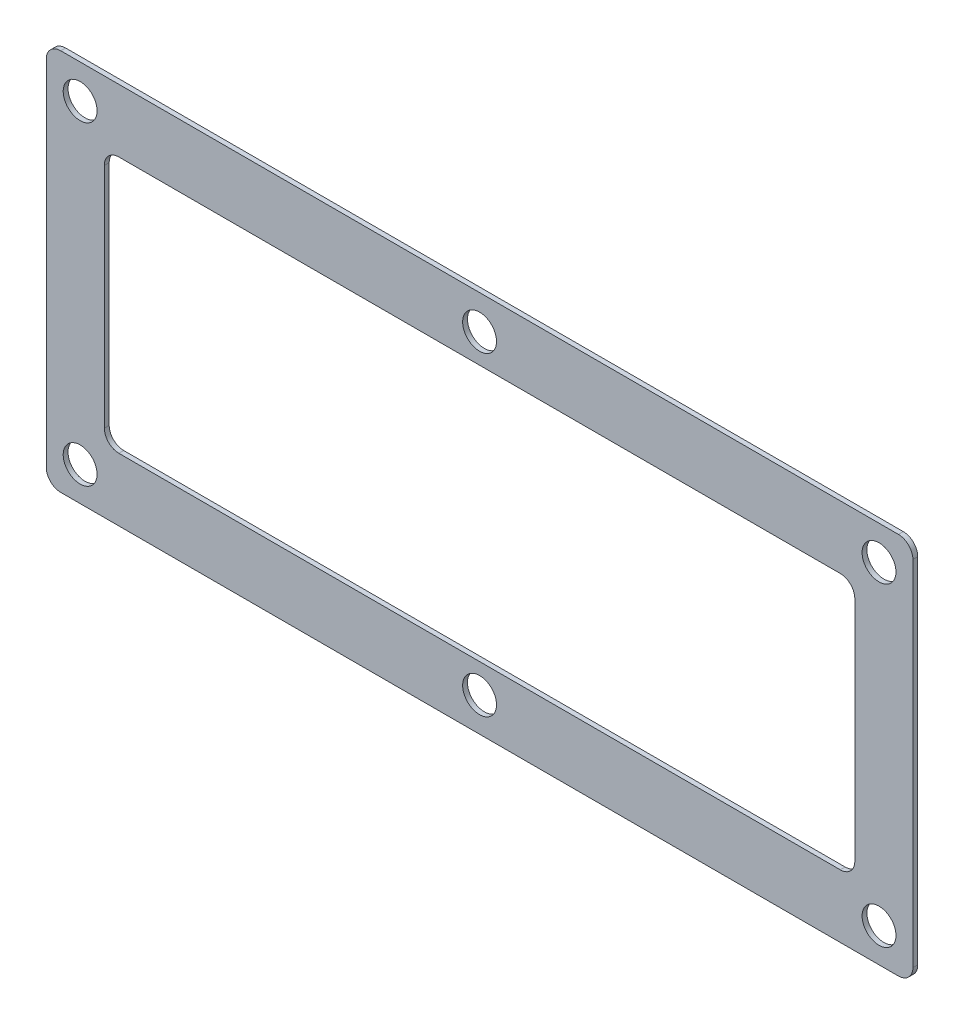
ISO-10303-21;
HEADER;
FILE_DESCRIPTION(('STEP AP214'),'2;1');
FILE_NAME('part.step','',(''),(''),'','','');
FILE_SCHEMA(('AUTOMOTIVE_DESIGN { 1 0 10303 214 1 1 1 1 }'));
ENDSEC;
DATA;
#1=APPLICATION_CONTEXT('core data for automotive mechanical design processes');
#2=APPLICATION_PROTOCOL_DEFINITION('international standard','automotive_design',2000,#1);
#3=PRODUCT_CONTEXT('',#1,'mechanical');
#4=PRODUCT('Part','Part','',(#3));
#5=PRODUCT_RELATED_PRODUCT_CATEGORY('part','',(#4));
#6=PRODUCT_DEFINITION_FORMATION('','',#4);
#7=PRODUCT_DEFINITION_CONTEXT('part definition',#1,'design');
#8=PRODUCT_DEFINITION('design','',#6,#7);
#9=PRODUCT_DEFINITION_SHAPE('','',#8);
#10=(LENGTH_UNIT() NAMED_UNIT(*) SI_UNIT(.MILLI.,.METRE.));
#11=(NAMED_UNIT(*) PLANE_ANGLE_UNIT() SI_UNIT($,.RADIAN.));
#12=(NAMED_UNIT(*) SI_UNIT($,.STERADIAN.) SOLID_ANGLE_UNIT());
#13=UNCERTAINTY_MEASURE_WITH_UNIT(LENGTH_MEASURE(1.E-05),#10,'distance_accuracy_value','');
#14=(GEOMETRIC_REPRESENTATION_CONTEXT(3) GLOBAL_UNCERTAINTY_ASSIGNED_CONTEXT((#13)) GLOBAL_UNIT_ASSIGNED_CONTEXT((#10,
#11,#12)) REPRESENTATION_CONTEXT('',''));
#15=CARTESIAN_POINT('',(0.,0.,0.));
#16=DIRECTION('',(0.,0.,1.));
#17=DIRECTION('',(1.,0.,0.));
#18=AXIS2_PLACEMENT_3D('',#15,#16,#17);
#19=CARTESIAN_POINT('',(0.,0.,0.));
#20=DIRECTION('',(0.,0.,-1.));
#21=DIRECTION('',(-1.,0.,0.));
#22=AXIS2_PLACEMENT_3D('',#19,#20,#21);
#23=PLANE('',#22);
#24=DIRECTION('',(-1.,0.,0.));
#25=VECTOR('',#24,1.);
#26=CARTESIAN_POINT('',(77.5,26.5,0.));
#27=LINE('',#26,#25);
#28=CARTESIAN_POINT('',(74.5,26.5,0.));
#29=VERTEX_POINT('',#28);
#30=CARTESIAN_POINT('',(-74.5,26.5,0.));
#31=VERTEX_POINT('',#30);
#32=EDGE_CURVE('E277',#29,#31,#27,.T.);
#33=ORIENTED_EDGE('',*,*,#32,.T.);
#34=CARTESIAN_POINT('',(-74.5,23.5,0.));
#35=DIRECTION('',(0.,0.,-1.));
#36=DIRECTION('',(-1.,0.,0.));
#37=AXIS2_PLACEMENT_3D('',#34,#35,#36);
#38=CIRCLE('',#37,3.);
#39=CARTESIAN_POINT('',(-77.5,23.5,0.));
#40=VERTEX_POINT('',#39);
#41=EDGE_CURVE('E11',#31,#40,#38,.F.);
#42=ORIENTED_EDGE('',*,*,#41,.T.);
#43=DIRECTION('',(0.,-1.,0.));
#44=VECTOR('',#43,1.);
#45=CARTESIAN_POINT('',(-77.5,-26.5,0.));
#46=LINE('',#45,#44);
#47=CARTESIAN_POINT('',(-77.5,-23.5,0.));
#48=VERTEX_POINT('',#47);
#49=EDGE_CURVE('E264',#40,#48,#46,.T.);
#50=ORIENTED_EDGE('',*,*,#49,.T.);
#51=CARTESIAN_POINT('',(-74.5,-23.5,0.));
#52=DIRECTION('',(0.,0.,-1.));
#53=DIRECTION('',(-1.,0.,0.));
#54=AXIS2_PLACEMENT_3D('',#51,#52,#53);
#55=CIRCLE('',#54,3.);
#56=CARTESIAN_POINT('',(-74.5,-26.5,0.));
#57=VERTEX_POINT('',#56);
#58=EDGE_CURVE('E247',#48,#57,#55,.F.);
#59=ORIENTED_EDGE('',*,*,#58,.T.);
#60=DIRECTION('',(1.,0.,0.));
#61=VECTOR('',#60,1.);
#62=CARTESIAN_POINT('',(77.5,-26.5,0.));
#63=LINE('',#62,#61);
#64=CARTESIAN_POINT('',(74.5,-26.5,0.));
#65=VERTEX_POINT('',#64);
#66=EDGE_CURVE('E269',#57,#65,#63,.T.);
#67=ORIENTED_EDGE('',*,*,#66,.T.);
#68=CARTESIAN_POINT('',(74.5,-23.5,0.));
#69=DIRECTION('',(0.,0.,-1.));
#70=DIRECTION('',(-1.,0.,0.));
#71=AXIS2_PLACEMENT_3D('',#68,#69,#70);
#72=CIRCLE('',#71,3.);
#73=CARTESIAN_POINT('',(77.5,-23.5,0.));
#74=VERTEX_POINT('',#73);
#75=EDGE_CURVE('E243',#65,#74,#72,.F.);
#76=ORIENTED_EDGE('',*,*,#75,.T.);
#77=DIRECTION('',(0.,1.,0.));
#78=VECTOR('',#77,1.);
#79=CARTESIAN_POINT('',(77.5,-26.5,0.));
#80=LINE('',#79,#78);
#81=CARTESIAN_POINT('',(77.5,23.5,0.));
#82=VERTEX_POINT('',#81);
#83=EDGE_CURVE('E272',#74,#82,#80,.T.);
#84=ORIENTED_EDGE('',*,*,#83,.T.);
#85=CARTESIAN_POINT('',(74.5,23.5,0.));
#86=DIRECTION('',(0.,0.,-1.));
#87=DIRECTION('',(-1.,0.,0.));
#88=AXIS2_PLACEMENT_3D('',#85,#86,#87);
#89=CIRCLE('',#88,3.);
#90=EDGE_CURVE('E239',#82,#29,#89,.F.);
#91=ORIENTED_EDGE('',*,*,#90,.T.);
#92=EDGE_LOOP('',(#33,#42,#50,#59,#67,#76,#84,#91));
#93=FACE_BOUND('',#92,.T.);
#94=CARTESIAN_POINT('',(-82.5,32.5,0.));
#95=DIRECTION('',(0.,0.,1.));
#96=DIRECTION('',(1.,0.,0.));
#97=AXIS2_PLACEMENT_3D('',#94,#95,#96);
#98=CIRCLE('',#97,3.5);
#99=CARTESIAN_POINT('',(-79.,32.5,0.));
#100=VERTEX_POINT('',#99);
#101=EDGE_CURVE('E294',#100,#100,#98,.T.);
#102=ORIENTED_EDGE('',*,*,#101,.T.);
#103=EDGE_LOOP('',(#102));
#104=FACE_BOUND('',#103,.T.);
#105=CARTESIAN_POINT('',(82.5,-32.5,0.));
#106=DIRECTION('',(0.,0.,1.));
#107=DIRECTION('',(1.,0.,0.));
#108=AXIS2_PLACEMENT_3D('',#105,#106,#107);
#109=CIRCLE('',#108,3.5);
#110=CARTESIAN_POINT('',(86.,-32.5,0.));
#111=VERTEX_POINT('',#110);
#112=EDGE_CURVE('E306',#111,#111,#109,.T.);
#113=ORIENTED_EDGE('',*,*,#112,.T.);
#114=EDGE_LOOP('',(#113));
#115=FACE_BOUND('',#114,.T.);
#116=CARTESIAN_POINT('',(0.,-32.5,0.));
#117=DIRECTION('',(0.,0.,1.));
#118=DIRECTION('',(1.,0.,0.));
#119=AXIS2_PLACEMENT_3D('',#116,#117,#118);
#120=CIRCLE('',#119,3.5);
#121=CARTESIAN_POINT('',(3.50000000000001,-32.5,0.));
#122=VERTEX_POINT('',#121);
#123=EDGE_CURVE('E312',#122,#122,#120,.T.);
#124=ORIENTED_EDGE('',*,*,#123,.T.);
#125=EDGE_LOOP('',(#124));
#126=FACE_BOUND('',#125,.T.);
#127=DIRECTION('',(0.,1.,0.));
#128=VECTOR('',#127,1.);
#129=CARTESIAN_POINT('',(89.5,-39.5,0.));
#130=LINE('',#129,#128);
#131=CARTESIAN_POINT('',(89.5,-36.5,0.));
#132=VERTEX_POINT('',#131);
#133=CARTESIAN_POINT('',(89.5,36.5,0.));
#134=VERTEX_POINT('',#133);
#135=EDGE_CURVE('E166',#132,#134,#130,.T.);
#136=ORIENTED_EDGE('',*,*,#135,.F.);
#137=CARTESIAN_POINT('',(86.5,-36.5,0.));
#138=DIRECTION('',(0.,0.,-1.));
#139=DIRECTION('',(-1.,0.,0.));
#140=AXIS2_PLACEMENT_3D('',#137,#138,#139);
#141=CIRCLE('',#140,3.);
#142=CARTESIAN_POINT('',(86.5,-39.5,0.));
#143=VERTEX_POINT('',#142);
#144=EDGE_CURVE('E149',#132,#143,#141,.T.);
#145=ORIENTED_EDGE('',*,*,#144,.T.);
#146=DIRECTION('',(1.,0.,0.));
#147=VECTOR('',#146,1.);
#148=CARTESIAN_POINT('',(-89.5,-39.5,0.));
#149=LINE('',#148,#147);
#150=CARTESIAN_POINT('',(-86.5,-39.5,0.));
#151=VERTEX_POINT('',#150);
#152=EDGE_CURVE('E190',#151,#143,#149,.T.);
#153=ORIENTED_EDGE('',*,*,#152,.F.);
#154=CARTESIAN_POINT('',(-86.5,-36.5,0.));
#155=DIRECTION('',(0.,0.,-1.));
#156=DIRECTION('',(-1.,0.,0.));
#157=AXIS2_PLACEMENT_3D('',#154,#155,#156);
#158=CIRCLE('',#157,3.);
#159=CARTESIAN_POINT('',(-89.5,-36.5,0.));
#160=VERTEX_POINT('',#159);
#161=EDGE_CURVE('E160',#151,#160,#158,.T.);
#162=ORIENTED_EDGE('',*,*,#161,.T.);
#163=DIRECTION('',(0.,-1.,0.));
#164=VECTOR('',#163,1.);
#165=CARTESIAN_POINT('',(-89.5,-39.5,0.));
#166=LINE('',#165,#164);
#167=CARTESIAN_POINT('',(-89.5,36.5,0.));
#168=VERTEX_POINT('',#167);
#169=EDGE_CURVE('E179',#168,#160,#166,.T.);
#170=ORIENTED_EDGE('',*,*,#169,.F.);
#171=CARTESIAN_POINT('',(-86.5,36.5,0.));
#172=DIRECTION('',(0.,0.,-1.));
#173=DIRECTION('',(-1.,0.,0.));
#174=AXIS2_PLACEMENT_3D('',#171,#172,#173);
#175=CIRCLE('',#174,3.);
#176=CARTESIAN_POINT('',(-86.5,39.5,0.));
#177=VERTEX_POINT('',#176);
#178=EDGE_CURVE('E194',#168,#177,#175,.T.);
#179=ORIENTED_EDGE('',*,*,#178,.T.);
#180=DIRECTION('',(-1.,0.,0.));
#181=VECTOR('',#180,1.);
#182=CARTESIAN_POINT('',(-89.5,39.5,0.));
#183=LINE('',#182,#181);
#184=CARTESIAN_POINT('',(86.5,39.5,0.));
#185=VERTEX_POINT('',#184);
#186=EDGE_CURVE('E175',#185,#177,#183,.T.);
#187=ORIENTED_EDGE('',*,*,#186,.F.);
#188=CARTESIAN_POINT('',(86.5,36.5,0.));
#189=DIRECTION('',(0.,0.,-1.));
#190=DIRECTION('',(-1.,0.,0.));
#191=AXIS2_PLACEMENT_3D('',#188,#189,#190);
#192=CIRCLE('',#191,3.);
#193=EDGE_CURVE('E170',#185,#134,#192,.T.);
#194=ORIENTED_EDGE('',*,*,#193,.T.);
#195=EDGE_LOOP('',(#136,#145,#153,#162,#170,#179,#187,#194));
#196=FACE_BOUND('',#195,.T.);
#197=CARTESIAN_POINT('',(-82.5,-32.5,0.));
#198=DIRECTION('',(0.,0.,1.));
#199=DIRECTION('',(1.,0.,0.));
#200=AXIS2_PLACEMENT_3D('',#197,#198,#199);
#201=CIRCLE('',#200,3.5);
#202=CARTESIAN_POINT('',(-79.,-32.5,0.));
#203=VERTEX_POINT('',#202);
#204=EDGE_CURVE('E176',#203,#203,#201,.T.);
#205=ORIENTED_EDGE('',*,*,#204,.T.);
#206=EDGE_LOOP('',(#205));
#207=FACE_BOUND('',#206,.T.);
#208=CARTESIAN_POINT('',(82.5,32.5,0.));
#209=DIRECTION('',(0.,0.,1.));
#210=DIRECTION('',(1.,0.,0.));
#211=AXIS2_PLACEMENT_3D('',#208,#209,#210);
#212=CIRCLE('',#211,3.5);
#213=CARTESIAN_POINT('',(86.,32.5,0.));
#214=VERTEX_POINT('',#213);
#215=EDGE_CURVE('E300',#214,#214,#212,.T.);
#216=ORIENTED_EDGE('',*,*,#215,.T.);
#217=EDGE_LOOP('',(#216));
#218=FACE_BOUND('',#217,.T.);
#219=CARTESIAN_POINT('',(0.,32.5,0.));
#220=DIRECTION('',(0.,0.,1.));
#221=DIRECTION('',(1.,0.,0.));
#222=AXIS2_PLACEMENT_3D('',#219,#220,#221);
#223=CIRCLE('',#222,3.5);
#224=CARTESIAN_POINT('',(3.5,32.5,0.));
#225=VERTEX_POINT('',#224);
#226=EDGE_CURVE('E288',#225,#225,#223,.T.);
#227=ORIENTED_EDGE('',*,*,#226,.T.);
#228=EDGE_LOOP('',(#227));
#229=FACE_BOUND('',#228,.T.);
#230=ADVANCED_FACE('F36',(#93,#104,#115,#126,#196,#207,#218,#229),#23,.T.);
#231=CARTESIAN_POINT('',(89.5,-39.5,1.));
#232=DIRECTION('',(-1.,0.,0.));
#233=DIRECTION('',(0.,0.,1.));
#234=AXIS2_PLACEMENT_3D('',#231,#232,#233);
#235=PLANE('',#234);
#236=DIRECTION('',(0.,1.,0.));
#237=VECTOR('',#236,1.);
#238=CARTESIAN_POINT('',(89.5,-39.5,1.));
#239=LINE('',#238,#237);
#240=CARTESIAN_POINT('',(89.5,-36.5,1.));
#241=VERTEX_POINT('',#240);
#242=CARTESIAN_POINT('',(89.5,36.5,1.));
#243=VERTEX_POINT('',#242);
#244=EDGE_CURVE('E169',#241,#243,#239,.T.);
#245=ORIENTED_EDGE('',*,*,#244,.F.);
#246=DIRECTION('',(0.,0.,-1.));
#247=VECTOR('',#246,1.);
#248=CARTESIAN_POINT('',(89.5,-36.5,1.));
#249=LINE('',#248,#247);
#250=EDGE_CURVE('E153',#241,#132,#249,.T.);
#251=ORIENTED_EDGE('',*,*,#250,.T.);
#252=ORIENTED_EDGE('',*,*,#135,.T.);
#253=DIRECTION('',(0.,0.,-1.));
#254=VECTOR('',#253,1.);
#255=CARTESIAN_POINT('',(89.5,36.5,1.));
#256=LINE('',#255,#254);
#257=EDGE_CURVE('E171',#134,#243,#256,.F.);
#258=ORIENTED_EDGE('',*,*,#257,.T.);
#259=EDGE_LOOP('',(#245,#251,#252,#258));
#260=FACE_BOUND('',#259,.T.);
#261=ADVANCED_FACE('F165',(#260),#235,.F.);
#262=CARTESIAN_POINT('',(-89.5,39.5,1.));
#263=DIRECTION('',(0.,-1.,0.));
#264=DIRECTION('',(0.,0.,-1.));
#265=AXIS2_PLACEMENT_3D('',#262,#263,#264);
#266=PLANE('',#265);
#267=ORIENTED_EDGE('',*,*,#186,.T.);
#268=DIRECTION('',(0.,0.,-1.));
#269=VECTOR('',#268,1.);
#270=CARTESIAN_POINT('',(-86.5,39.5,1.));
#271=LINE('',#270,#269);
#272=CARTESIAN_POINT('',(-86.5,39.5,1.));
#273=VERTEX_POINT('',#272);
#274=EDGE_CURVE('E216',#177,#273,#271,.F.);
#275=ORIENTED_EDGE('',*,*,#274,.T.);
#276=DIRECTION('',(-1.,0.,0.));
#277=VECTOR('',#276,1.);
#278=CARTESIAN_POINT('',(-89.5,39.5,1.));
#279=LINE('',#278,#277);
#280=CARTESIAN_POINT('',(86.5,39.5,1.));
#281=VERTEX_POINT('',#280);
#282=EDGE_CURVE('E318',#281,#273,#279,.T.);
#283=ORIENTED_EDGE('',*,*,#282,.F.);
#284=DIRECTION('',(0.,0.,-1.));
#285=VECTOR('',#284,1.);
#286=CARTESIAN_POINT('',(86.5,39.5,1.));
#287=LINE('',#286,#285);
#288=EDGE_CURVE('E213',#281,#185,#287,.T.);
#289=ORIENTED_EDGE('',*,*,#288,.T.);
#290=EDGE_LOOP('',(#267,#275,#283,#289));
#291=FACE_BOUND('',#290,.T.);
#292=ADVANCED_FACE('F342',(#291),#266,.F.);
#293=CARTESIAN_POINT('',(-89.5,-39.5,1.));
#294=DIRECTION('',(1.,0.,0.));
#295=DIRECTION('',(0.,0.,-1.));
#296=AXIS2_PLACEMENT_3D('',#293,#294,#295);
#297=PLANE('',#296);
#298=ORIENTED_EDGE('',*,*,#169,.T.);
#299=DIRECTION('',(0.,0.,-1.));
#300=VECTOR('',#299,1.);
#301=CARTESIAN_POINT('',(-89.5,-36.5,1.));
#302=LINE('',#301,#300);
#303=CARTESIAN_POINT('',(-89.5,-36.5,1.));
#304=VERTEX_POINT('',#303);
#305=EDGE_CURVE('E211',#160,#304,#302,.F.);
#306=ORIENTED_EDGE('',*,*,#305,.T.);
#307=DIRECTION('',(0.,-1.,0.));
#308=VECTOR('',#307,1.);
#309=CARTESIAN_POINT('',(-89.5,-39.5,1.));
#310=LINE('',#309,#308);
#311=CARTESIAN_POINT('',(-89.5,36.5,1.));
#312=VERTEX_POINT('',#311);
#313=EDGE_CURVE('E320',#312,#304,#310,.T.);
#314=ORIENTED_EDGE('',*,*,#313,.F.);
#315=DIRECTION('',(0.,0.,-1.));
#316=VECTOR('',#315,1.);
#317=CARTESIAN_POINT('',(-89.5,36.5,1.));
#318=LINE('',#317,#316);
#319=EDGE_CURVE('E208',#312,#168,#318,.T.);
#320=ORIENTED_EDGE('',*,*,#319,.T.);
#321=EDGE_LOOP('',(#298,#306,#314,#320));
#322=FACE_BOUND('',#321,.T.);
#323=ADVANCED_FACE('F335',(#322),#297,.F.);
#324=CARTESIAN_POINT('',(-89.5,-39.5,1.));
#325=DIRECTION('',(0.,1.,0.));
#326=DIRECTION('',(0.,0.,1.));
#327=AXIS2_PLACEMENT_3D('',#324,#325,#326);
#328=PLANE('',#327);
#329=ORIENTED_EDGE('',*,*,#152,.T.);
#330=DIRECTION('',(0.,0.,-1.));
#331=VECTOR('',#330,1.);
#332=CARTESIAN_POINT('',(86.5,-39.5,1.));
#333=LINE('',#332,#331);
#334=CARTESIAN_POINT('',(86.5,-39.5,1.));
#335=VERTEX_POINT('',#334);
#336=EDGE_CURVE('E154',#143,#335,#333,.F.);
#337=ORIENTED_EDGE('',*,*,#336,.T.);
#338=DIRECTION('',(1.,0.,0.));
#339=VECTOR('',#338,1.);
#340=CARTESIAN_POINT('',(-89.5,-39.5,1.));
#341=LINE('',#340,#339);
#342=CARTESIAN_POINT('',(-86.5,-39.5,1.));
#343=VERTEX_POINT('',#342);
#344=EDGE_CURVE('E185',#343,#335,#341,.T.);
#345=ORIENTED_EDGE('',*,*,#344,.F.);
#346=DIRECTION('',(0.,0.,-1.));
#347=VECTOR('',#346,1.);
#348=CARTESIAN_POINT('',(-86.5,-39.5,1.));
#349=LINE('',#348,#347);
#350=EDGE_CURVE('E159',#343,#151,#349,.T.);
#351=ORIENTED_EDGE('',*,*,#350,.T.);
#352=EDGE_LOOP('',(#329,#337,#345,#351));
#353=FACE_BOUND('',#352,.T.);
#354=ADVANCED_FACE('F329',(#353),#328,.F.);
#355=CARTESIAN_POINT('',(0.,0.,1.));
#356=DIRECTION('',(0.,0.,-1.));
#357=DIRECTION('',(-1.,0.,0.));
#358=AXIS2_PLACEMENT_3D('',#355,#356,#357);
#359=PLANE('',#358);
#360=DIRECTION('',(1.,0.,0.));
#361=VECTOR('',#360,1.);
#362=CARTESIAN_POINT('',(77.5,-26.5,1.));
#363=LINE('',#362,#361);
#364=CARTESIAN_POINT('',(-74.5,-26.5,1.));
#365=VERTEX_POINT('',#364);
#366=CARTESIAN_POINT('',(74.5,-26.5,1.));
#367=VERTEX_POINT('',#366);
#368=EDGE_CURVE('E281',#365,#367,#363,.T.);
#369=ORIENTED_EDGE('',*,*,#368,.F.);
#370=CARTESIAN_POINT('',(-74.5,-23.5,1.));
#371=DIRECTION('',(0.,0.,-1.));
#372=DIRECTION('',(-1.,0.,0.));
#373=AXIS2_PLACEMENT_3D('',#370,#371,#372);
#374=CIRCLE('',#373,3.);
#375=CARTESIAN_POINT('',(-77.5,-23.5,1.));
#376=VERTEX_POINT('',#375);
#377=EDGE_CURVE('E245',#365,#376,#374,.T.);
#378=ORIENTED_EDGE('',*,*,#377,.T.);
#379=DIRECTION('',(0.,-1.,0.));
#380=VECTOR('',#379,1.);
#381=CARTESIAN_POINT('',(-77.5,-26.5,1.));
#382=LINE('',#381,#380);
#383=CARTESIAN_POINT('',(-77.5,23.5,1.));
#384=VERTEX_POINT('',#383);
#385=EDGE_CURVE('E256',#384,#376,#382,.T.);
#386=ORIENTED_EDGE('',*,*,#385,.F.);
#387=CARTESIAN_POINT('',(-74.5,23.5,1.));
#388=DIRECTION('',(0.,0.,-1.));
#389=DIRECTION('',(-1.,0.,0.));
#390=AXIS2_PLACEMENT_3D('',#387,#388,#389);
#391=CIRCLE('',#390,3.);
#392=CARTESIAN_POINT('',(-74.5,26.5,1.));
#393=VERTEX_POINT('',#392);
#394=EDGE_CURVE('E44',#384,#393,#391,.T.);
#395=ORIENTED_EDGE('',*,*,#394,.T.);
#396=DIRECTION('',(-1.,0.,0.));
#397=VECTOR('',#396,1.);
#398=CARTESIAN_POINT('',(77.5,26.5,1.));
#399=LINE('',#398,#397);
#400=CARTESIAN_POINT('',(74.5,26.5,1.));
#401=VERTEX_POINT('',#400);
#402=EDGE_CURVE('E255',#401,#393,#399,.T.);
#403=ORIENTED_EDGE('',*,*,#402,.F.);
#404=CARTESIAN_POINT('',(74.5,23.5,1.));
#405=DIRECTION('',(0.,0.,-1.));
#406=DIRECTION('',(-1.,0.,0.));
#407=AXIS2_PLACEMENT_3D('',#404,#405,#406);
#408=CIRCLE('',#407,3.);
#409=CARTESIAN_POINT('',(77.5,23.5,1.));
#410=VERTEX_POINT('',#409);
#411=EDGE_CURVE('E237',#401,#410,#408,.T.);
#412=ORIENTED_EDGE('',*,*,#411,.T.);
#413=DIRECTION('',(0.,1.,0.));
#414=VECTOR('',#413,1.);
#415=CARTESIAN_POINT('',(77.5,-26.5,1.));
#416=LINE('',#415,#414);
#417=CARTESIAN_POINT('',(77.5,-23.5,1.));
#418=VERTEX_POINT('',#417);
#419=EDGE_CURVE('E265',#418,#410,#416,.T.);
#420=ORIENTED_EDGE('',*,*,#419,.F.);
#421=CARTESIAN_POINT('',(74.5,-23.5,1.));
#422=DIRECTION('',(0.,0.,-1.));
#423=DIRECTION('',(-1.,0.,0.));
#424=AXIS2_PLACEMENT_3D('',#421,#422,#423);
#425=CIRCLE('',#424,3.);
#426=EDGE_CURVE('E241',#418,#367,#425,.T.);
#427=ORIENTED_EDGE('',*,*,#426,.T.);
#428=EDGE_LOOP('',(#369,#378,#386,#395,#403,#412,#420,#427));
#429=FACE_BOUND('',#428,.T.);
#430=CARTESIAN_POINT('',(0.,32.5,1.));
#431=DIRECTION('',(0.,0.,1.));
#432=DIRECTION('',(1.,0.,0.));
#433=AXIS2_PLACEMENT_3D('',#430,#431,#432);
#434=CIRCLE('',#433,3.5);
#435=CARTESIAN_POINT('',(3.5,32.5,1.));
#436=VERTEX_POINT('',#435);
#437=EDGE_CURVE('E279',#436,#436,#434,.T.);
#438=ORIENTED_EDGE('',*,*,#437,.F.);
#439=EDGE_LOOP('',(#438));
#440=FACE_BOUND('',#439,.T.);
#441=CARTESIAN_POINT('',(-82.5,32.5,1.));
#442=DIRECTION('',(0.,0.,1.));
#443=DIRECTION('',(1.,0.,0.));
#444=AXIS2_PLACEMENT_3D('',#441,#442,#443);
#445=CIRCLE('',#444,3.5);
#446=CARTESIAN_POINT('',(-79.,32.5,1.));
#447=VERTEX_POINT('',#446);
#448=EDGE_CURVE('E291',#447,#447,#445,.T.);
#449=ORIENTED_EDGE('',*,*,#448,.F.);
#450=EDGE_LOOP('',(#449));
#451=FACE_BOUND('',#450,.T.);
#452=CARTESIAN_POINT('',(82.5,32.5,1.));
#453=DIRECTION('',(0.,0.,1.));
#454=DIRECTION('',(1.,0.,0.));
#455=AXIS2_PLACEMENT_3D('',#452,#453,#454);
#456=CIRCLE('',#455,3.5);
#457=CARTESIAN_POINT('',(86.,32.5,1.));
#458=VERTEX_POINT('',#457);
#459=EDGE_CURVE('E297',#458,#458,#456,.T.);
#460=ORIENTED_EDGE('',*,*,#459,.F.);
#461=EDGE_LOOP('',(#460));
#462=FACE_BOUND('',#461,.T.);
#463=CARTESIAN_POINT('',(82.5,-32.5,1.));
#464=DIRECTION('',(0.,0.,1.));
#465=DIRECTION('',(1.,0.,0.));
#466=AXIS2_PLACEMENT_3D('',#463,#464,#465);
#467=CIRCLE('',#466,3.5);
#468=CARTESIAN_POINT('',(86.,-32.5,1.));
#469=VERTEX_POINT('',#468);
#470=EDGE_CURVE('E303',#469,#469,#467,.T.);
#471=ORIENTED_EDGE('',*,*,#470,.F.);
#472=EDGE_LOOP('',(#471));
#473=FACE_BOUND('',#472,.T.);
#474=CARTESIAN_POINT('',(0.,-32.5,1.));
#475=DIRECTION('',(0.,0.,1.));
#476=DIRECTION('',(1.,0.,0.));
#477=AXIS2_PLACEMENT_3D('',#474,#475,#476);
#478=CIRCLE('',#477,3.5);
#479=CARTESIAN_POINT('',(3.50000000000001,-32.5,1.));
#480=VERTEX_POINT('',#479);
#481=EDGE_CURVE('E309',#480,#480,#478,.T.);
#482=ORIENTED_EDGE('',*,*,#481,.F.);
#483=EDGE_LOOP('',(#482));
#484=FACE_BOUND('',#483,.T.);
#485=CARTESIAN_POINT('',(-82.5,-32.5,1.));
#486=DIRECTION('',(0.,0.,1.));
#487=DIRECTION('',(1.,0.,0.));
#488=AXIS2_PLACEMENT_3D('',#485,#486,#487);
#489=CIRCLE('',#488,3.5);
#490=CARTESIAN_POINT('',(-79.,-32.5,1.));
#491=VERTEX_POINT('',#490);
#492=EDGE_CURVE('E182',#491,#491,#489,.T.);
#493=ORIENTED_EDGE('',*,*,#492,.F.);
#494=EDGE_LOOP('',(#493));
#495=FACE_BOUND('',#494,.T.);
#496=ORIENTED_EDGE('',*,*,#344,.T.);
#497=CARTESIAN_POINT('',(86.5,-36.5,1.));
#498=DIRECTION('',(0.,0.,-1.));
#499=DIRECTION('',(-1.,0.,0.));
#500=AXIS2_PLACEMENT_3D('',#497,#498,#499);
#501=CIRCLE('',#500,3.);
#502=EDGE_CURVE('E206',#335,#241,#501,.F.);
#503=ORIENTED_EDGE('',*,*,#502,.T.);
#504=ORIENTED_EDGE('',*,*,#244,.T.);
#505=CARTESIAN_POINT('',(86.5,36.5,1.));
#506=DIRECTION('',(0.,0.,-1.));
#507=DIRECTION('',(-1.,0.,0.));
#508=AXIS2_PLACEMENT_3D('',#505,#506,#507);
#509=CIRCLE('',#508,3.);
#510=EDGE_CURVE('E200',#243,#281,#509,.F.);
#511=ORIENTED_EDGE('',*,*,#510,.T.);
#512=ORIENTED_EDGE('',*,*,#282,.T.);
#513=CARTESIAN_POINT('',(-86.5,36.5,1.));
#514=DIRECTION('',(0.,0.,-1.));
#515=DIRECTION('',(-1.,0.,0.));
#516=AXIS2_PLACEMENT_3D('',#513,#514,#515);
#517=CIRCLE('',#516,3.);
#518=EDGE_CURVE('E202',#273,#312,#517,.F.);
#519=ORIENTED_EDGE('',*,*,#518,.T.);
#520=ORIENTED_EDGE('',*,*,#313,.T.);
#521=CARTESIAN_POINT('',(-86.5,-36.5,1.));
#522=DIRECTION('',(0.,0.,-1.));
#523=DIRECTION('',(-1.,0.,0.));
#524=AXIS2_PLACEMENT_3D('',#521,#522,#523);
#525=CIRCLE('',#524,3.);
#526=EDGE_CURVE('E204',#304,#343,#525,.F.);
#527=ORIENTED_EDGE('',*,*,#526,.T.);
#528=EDGE_LOOP('',(#496,#503,#504,#511,#512,#519,#520,#527));
#529=FACE_BOUND('',#528,.T.);
#530=ADVANCED_FACE('F253',(#429,#440,#451,#462,#473,#484,#495,#529),#359,.F.);
#531=CARTESIAN_POINT('',(86.5,-36.5,1.));
#532=DIRECTION('',(0.,0.,-1.));
#533=DIRECTION('',(-1.,0.,0.));
#534=AXIS2_PLACEMENT_3D('',#531,#532,#533);
#535=CYLINDRICAL_SURFACE('',#534,3.);
#536=ORIENTED_EDGE('',*,*,#502,.F.);
#537=ORIENTED_EDGE('',*,*,#336,.F.);
#538=ORIENTED_EDGE('',*,*,#144,.F.);
#539=ORIENTED_EDGE('',*,*,#250,.F.);
#540=EDGE_LOOP('',(#536,#537,#538,#539));
#541=FACE_BOUND('',#540,.T.);
#542=ADVANCED_FACE('F152',(#541),#535,.T.);
#543=CARTESIAN_POINT('',(-86.5,-36.5,1.));
#544=DIRECTION('',(0.,0.,-1.));
#545=DIRECTION('',(-1.,0.,0.));
#546=AXIS2_PLACEMENT_3D('',#543,#544,#545);
#547=CYLINDRICAL_SURFACE('',#546,3.);
#548=ORIENTED_EDGE('',*,*,#526,.F.);
#549=ORIENTED_EDGE('',*,*,#305,.F.);
#550=ORIENTED_EDGE('',*,*,#161,.F.);
#551=ORIENTED_EDGE('',*,*,#350,.F.);
#552=EDGE_LOOP('',(#548,#549,#550,#551));
#553=FACE_BOUND('',#552,.T.);
#554=ADVANCED_FACE('F331',(#553),#547,.T.);
#555=CARTESIAN_POINT('',(-86.5,36.5,1.));
#556=DIRECTION('',(0.,0.,-1.));
#557=DIRECTION('',(-1.,0.,0.));
#558=AXIS2_PLACEMENT_3D('',#555,#556,#557);
#559=CYLINDRICAL_SURFACE('',#558,3.);
#560=ORIENTED_EDGE('',*,*,#518,.F.);
#561=ORIENTED_EDGE('',*,*,#274,.F.);
#562=ORIENTED_EDGE('',*,*,#178,.F.);
#563=ORIENTED_EDGE('',*,*,#319,.F.);
#564=EDGE_LOOP('',(#560,#561,#562,#563));
#565=FACE_BOUND('',#564,.T.);
#566=ADVANCED_FACE('F339',(#565),#559,.T.);
#567=CARTESIAN_POINT('',(86.5,36.5,1.));
#568=DIRECTION('',(0.,0.,-1.));
#569=DIRECTION('',(-1.,0.,0.));
#570=AXIS2_PLACEMENT_3D('',#567,#568,#569);
#571=CYLINDRICAL_SURFACE('',#570,3.);
#572=ORIENTED_EDGE('',*,*,#510,.F.);
#573=ORIENTED_EDGE('',*,*,#257,.F.);
#574=ORIENTED_EDGE('',*,*,#193,.F.);
#575=ORIENTED_EDGE('',*,*,#288,.F.);
#576=EDGE_LOOP('',(#572,#573,#574,#575));
#577=FACE_BOUND('',#576,.T.);
#578=ADVANCED_FACE('F347',(#577),#571,.T.);
#579=CARTESIAN_POINT('',(-82.5,-32.5,1.));
#580=DIRECTION('',(0.,0.,1.));
#581=DIRECTION('',(1.,0.,0.));
#582=AXIS2_PLACEMENT_3D('',#579,#580,#581);
#583=CYLINDRICAL_SURFACE('',#582,3.5);
#584=ORIENTED_EDGE('',*,*,#204,.F.);
#585=EDGE_LOOP('',(#584));
#586=FACE_BOUND('',#585,.T.);
#587=ORIENTED_EDGE('',*,*,#492,.T.);
#588=EDGE_LOOP('',(#587));
#589=FACE_BOUND('',#588,.T.);
#590=ADVANCED_FACE('F349',(#586,#589),#583,.F.);
#591=CARTESIAN_POINT('',(0.,-32.5,1.));
#592=DIRECTION('',(0.,0.,1.));
#593=DIRECTION('',(1.,0.,0.));
#594=AXIS2_PLACEMENT_3D('',#591,#592,#593);
#595=CYLINDRICAL_SURFACE('',#594,3.5);
#596=ORIENTED_EDGE('',*,*,#123,.F.);
#597=EDGE_LOOP('',(#596));
#598=FACE_BOUND('',#597,.T.);
#599=ORIENTED_EDGE('',*,*,#481,.T.);
#600=EDGE_LOOP('',(#599));
#601=FACE_BOUND('',#600,.T.);
#602=ADVANCED_FACE('F355',(#598,#601),#595,.F.);
#603=CARTESIAN_POINT('',(82.5,-32.5,1.));
#604=DIRECTION('',(0.,0.,1.));
#605=DIRECTION('',(1.,0.,0.));
#606=AXIS2_PLACEMENT_3D('',#603,#604,#605);
#607=CYLINDRICAL_SURFACE('',#606,3.5);
#608=ORIENTED_EDGE('',*,*,#112,.F.);
#609=EDGE_LOOP('',(#608));
#610=FACE_BOUND('',#609,.T.);
#611=ORIENTED_EDGE('',*,*,#470,.T.);
#612=EDGE_LOOP('',(#611));
#613=FACE_BOUND('',#612,.T.);
#614=ADVANCED_FACE('F406',(#610,#613),#607,.F.);
#615=CARTESIAN_POINT('',(82.5,32.5,1.));
#616=DIRECTION('',(0.,0.,1.));
#617=DIRECTION('',(1.,0.,0.));
#618=AXIS2_PLACEMENT_3D('',#615,#616,#617);
#619=CYLINDRICAL_SURFACE('',#618,3.5);
#620=ORIENTED_EDGE('',*,*,#215,.F.);
#621=EDGE_LOOP('',(#620));
#622=FACE_BOUND('',#621,.T.);
#623=ORIENTED_EDGE('',*,*,#459,.T.);
#624=EDGE_LOOP('',(#623));
#625=FACE_BOUND('',#624,.T.);
#626=ADVANCED_FACE('F416',(#622,#625),#619,.F.);
#627=CARTESIAN_POINT('',(-82.5,32.5,1.));
#628=DIRECTION('',(0.,0.,1.));
#629=DIRECTION('',(1.,0.,0.));
#630=AXIS2_PLACEMENT_3D('',#627,#628,#629);
#631=CYLINDRICAL_SURFACE('',#630,3.5);
#632=ORIENTED_EDGE('',*,*,#101,.F.);
#633=EDGE_LOOP('',(#632));
#634=FACE_BOUND('',#633,.T.);
#635=ORIENTED_EDGE('',*,*,#448,.T.);
#636=EDGE_LOOP('',(#635));
#637=FACE_BOUND('',#636,.T.);
#638=ADVANCED_FACE('F426',(#634,#637),#631,.F.);
#639=CARTESIAN_POINT('',(0.,32.5,1.));
#640=DIRECTION('',(0.,0.,1.));
#641=DIRECTION('',(1.,0.,0.));
#642=AXIS2_PLACEMENT_3D('',#639,#640,#641);
#643=CYLINDRICAL_SURFACE('',#642,3.5);
#644=ORIENTED_EDGE('',*,*,#226,.F.);
#645=EDGE_LOOP('',(#644));
#646=FACE_BOUND('',#645,.T.);
#647=ORIENTED_EDGE('',*,*,#437,.T.);
#648=EDGE_LOOP('',(#647));
#649=FACE_BOUND('',#648,.T.);
#650=ADVANCED_FACE('F436',(#646,#649),#643,.F.);
#651=CARTESIAN_POINT('',(-77.5,-26.5,0.));
#652=DIRECTION('',(-1.,0.,0.));
#653=DIRECTION('',(0.,0.,1.));
#654=AXIS2_PLACEMENT_3D('',#651,#652,#653);
#655=PLANE('',#654);
#656=ORIENTED_EDGE('',*,*,#385,.T.);
#657=DIRECTION('',(0.,0.,1.));
#658=VECTOR('',#657,1.);
#659=CARTESIAN_POINT('',(-77.5,-23.5,0.));
#660=LINE('',#659,#658);
#661=EDGE_CURVE('E51',#376,#48,#660,.F.);
#662=ORIENTED_EDGE('',*,*,#661,.T.);
#663=ORIENTED_EDGE('',*,*,#49,.F.);
#664=DIRECTION('',(0.,0.,1.));
#665=VECTOR('',#664,1.);
#666=CARTESIAN_POINT('',(-77.5,23.5,1.));
#667=LINE('',#666,#665);
#668=EDGE_CURVE('E233',#40,#384,#667,.T.);
#669=ORIENTED_EDGE('',*,*,#668,.T.);
#670=EDGE_LOOP('',(#656,#662,#663,#669));
#671=FACE_BOUND('',#670,.T.);
#672=ADVANCED_FACE('F267',(#671),#655,.F.);
#673=CARTESIAN_POINT('',(77.5,26.5,0.));
#674=DIRECTION('',(0.,1.,0.));
#675=DIRECTION('',(0.,0.,1.));
#676=AXIS2_PLACEMENT_3D('',#673,#674,#675);
#677=PLANE('',#676);
#678=ORIENTED_EDGE('',*,*,#32,.F.);
#679=DIRECTION('',(0.,0.,1.));
#680=VECTOR('',#679,1.);
#681=CARTESIAN_POINT('',(74.5,26.5,1.));
#682=LINE('',#681,#680);
#683=EDGE_CURVE('E220',#29,#401,#682,.T.);
#684=ORIENTED_EDGE('',*,*,#683,.T.);
#685=ORIENTED_EDGE('',*,*,#402,.T.);
#686=DIRECTION('',(0.,0.,1.));
#687=VECTOR('',#686,1.);
#688=CARTESIAN_POINT('',(-74.5,26.5,0.));
#689=LINE('',#688,#687);
#690=EDGE_CURVE('E218',#393,#31,#689,.F.);
#691=ORIENTED_EDGE('',*,*,#690,.T.);
#692=EDGE_LOOP('',(#678,#684,#685,#691));
#693=FACE_BOUND('',#692,.T.);
#694=ADVANCED_FACE('F262',(#693),#677,.F.);
#695=CARTESIAN_POINT('',(77.5,-26.5,0.));
#696=DIRECTION('',(1.,0.,0.));
#697=DIRECTION('',(0.,0.,-1.));
#698=AXIS2_PLACEMENT_3D('',#695,#696,#697);
#699=PLANE('',#698);
#700=ORIENTED_EDGE('',*,*,#419,.T.);
#701=DIRECTION('',(0.,0.,1.));
#702=VECTOR('',#701,1.);
#703=CARTESIAN_POINT('',(77.5,23.5,0.));
#704=LINE('',#703,#702);
#705=EDGE_CURVE('E226',#410,#82,#704,.F.);
#706=ORIENTED_EDGE('',*,*,#705,.T.);
#707=ORIENTED_EDGE('',*,*,#83,.F.);
#708=DIRECTION('',(0.,0.,1.));
#709=VECTOR('',#708,1.);
#710=CARTESIAN_POINT('',(77.5,-23.5,1.));
#711=LINE('',#710,#709);
#712=EDGE_CURVE('E223',#74,#418,#711,.T.);
#713=ORIENTED_EDGE('',*,*,#712,.T.);
#714=EDGE_LOOP('',(#700,#706,#707,#713));
#715=FACE_BOUND('',#714,.T.);
#716=ADVANCED_FACE('F465',(#715),#699,.F.);
#717=CARTESIAN_POINT('',(77.5,-26.5,0.));
#718=DIRECTION('',(0.,-1.,0.));
#719=DIRECTION('',(0.,0.,-1.));
#720=AXIS2_PLACEMENT_3D('',#717,#718,#719);
#721=PLANE('',#720);
#722=ORIENTED_EDGE('',*,*,#368,.T.);
#723=DIRECTION('',(0.,0.,1.));
#724=VECTOR('',#723,1.);
#725=CARTESIAN_POINT('',(74.5,-26.5,0.));
#726=LINE('',#725,#724);
#727=EDGE_CURVE('E231',#367,#65,#726,.F.);
#728=ORIENTED_EDGE('',*,*,#727,.T.);
#729=ORIENTED_EDGE('',*,*,#66,.F.);
#730=DIRECTION('',(0.,0.,1.));
#731=VECTOR('',#730,1.);
#732=CARTESIAN_POINT('',(-74.5,-26.5,1.));
#733=LINE('',#732,#731);
#734=EDGE_CURVE('E228',#57,#365,#733,.T.);
#735=ORIENTED_EDGE('',*,*,#734,.T.);
#736=EDGE_LOOP('',(#722,#728,#729,#735));
#737=FACE_BOUND('',#736,.T.);
#738=ADVANCED_FACE('F474',(#737),#721,.F.);
#739=CARTESIAN_POINT('',(74.5,23.5,0.));
#740=DIRECTION('',(0.,0.,-1.));
#741=DIRECTION('',(-1.,0.,0.));
#742=AXIS2_PLACEMENT_3D('',#739,#740,#741);
#743=CYLINDRICAL_SURFACE('',#742,3.);
#744=ORIENTED_EDGE('',*,*,#90,.F.);
#745=ORIENTED_EDGE('',*,*,#705,.F.);
#746=ORIENTED_EDGE('',*,*,#411,.F.);
#747=ORIENTED_EDGE('',*,*,#683,.F.);
#748=EDGE_LOOP('',(#744,#745,#746,#747));
#749=FACE_BOUND('',#748,.T.);
#750=ADVANCED_FACE('F484',(#749),#743,.F.);
#751=CARTESIAN_POINT('',(74.5,-23.5,0.));
#752=DIRECTION('',(0.,0.,-1.));
#753=DIRECTION('',(-1.,0.,0.));
#754=AXIS2_PLACEMENT_3D('',#751,#752,#753);
#755=CYLINDRICAL_SURFACE('',#754,3.);
#756=ORIENTED_EDGE('',*,*,#75,.F.);
#757=ORIENTED_EDGE('',*,*,#727,.F.);
#758=ORIENTED_EDGE('',*,*,#426,.F.);
#759=ORIENTED_EDGE('',*,*,#712,.F.);
#760=EDGE_LOOP('',(#756,#757,#758,#759));
#761=FACE_BOUND('',#760,.T.);
#762=ADVANCED_FACE('F494',(#761),#755,.F.);
#763=CARTESIAN_POINT('',(-74.5,-23.5,0.));
#764=DIRECTION('',(0.,0.,-1.));
#765=DIRECTION('',(-1.,0.,0.));
#766=AXIS2_PLACEMENT_3D('',#763,#764,#765);
#767=CYLINDRICAL_SURFACE('',#766,3.);
#768=ORIENTED_EDGE('',*,*,#58,.F.);
#769=ORIENTED_EDGE('',*,*,#661,.F.);
#770=ORIENTED_EDGE('',*,*,#377,.F.);
#771=ORIENTED_EDGE('',*,*,#734,.F.);
#772=EDGE_LOOP('',(#768,#769,#770,#771));
#773=FACE_BOUND('',#772,.T.);
#774=ADVANCED_FACE('F503',(#773),#767,.F.);
#775=CARTESIAN_POINT('',(-74.5,23.5,0.));
#776=DIRECTION('',(0.,0.,-1.));
#777=DIRECTION('',(-1.,0.,0.));
#778=AXIS2_PLACEMENT_3D('',#775,#776,#777);
#779=CYLINDRICAL_SURFACE('',#778,3.);
#780=ORIENTED_EDGE('',*,*,#41,.F.);
#781=ORIENTED_EDGE('',*,*,#690,.F.);
#782=ORIENTED_EDGE('',*,*,#394,.F.);
#783=ORIENTED_EDGE('',*,*,#668,.F.);
#784=EDGE_LOOP('',(#780,#781,#782,#783));
#785=FACE_BOUND('',#784,.T.);
#786=ADVANCED_FACE('F38',(#785),#779,.F.);
#787=CLOSED_SHELL('',(#230,#261,#292,#323,#354,#530,#542,#554,#566,#578,#590,#602,#614,#626,
#638,#650,#672,#694,#716,#738,#750,#762,#774,#786));
#788=MANIFOLD_SOLID_BREP('B2',#787);
#789=ADVANCED_BREP_SHAPE_REPRESENTATION('',(#18,#788),#14);
#790=SHAPE_DEFINITION_REPRESENTATION(#9,#789);
ENDSEC;
END-ISO-10303-21;
